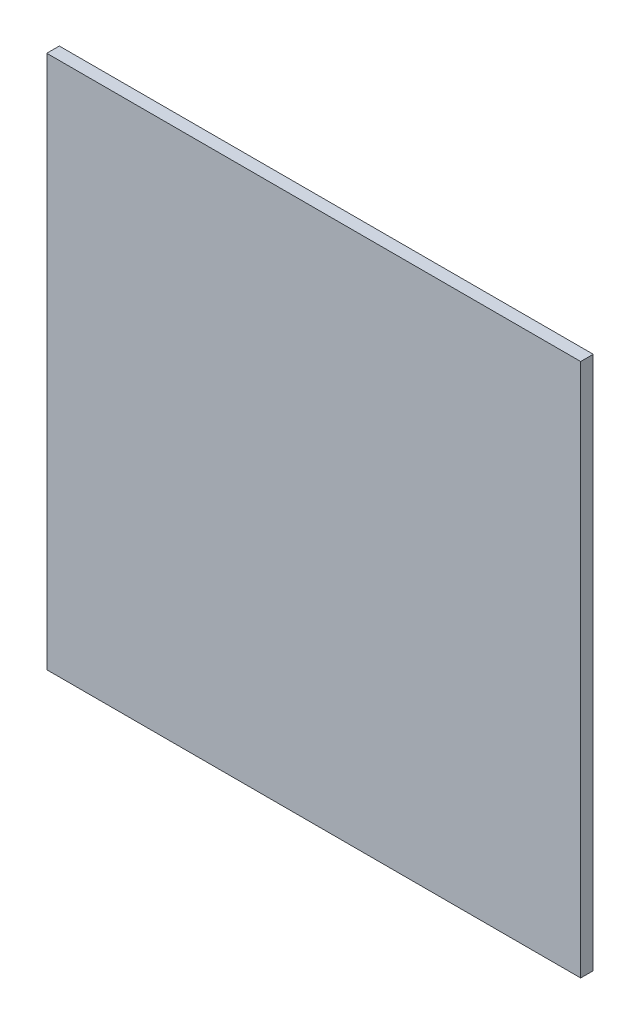
ISO-10303-21;
HEADER;
FILE_DESCRIPTION(('STEP AP214'),'2;1');
FILE_NAME('part.step','',(''),(''),'','','');
FILE_SCHEMA(('AUTOMOTIVE_DESIGN { 1 0 10303 214 1 1 1 1 }'));
ENDSEC;
DATA;
#1=APPLICATION_CONTEXT('core data for automotive mechanical design processes');
#2=APPLICATION_PROTOCOL_DEFINITION('international standard','automotive_design',2000,#1);
#3=PRODUCT_CONTEXT('',#1,'mechanical');
#4=PRODUCT('Part','Part','',(#3));
#5=PRODUCT_RELATED_PRODUCT_CATEGORY('part','',(#4));
#6=PRODUCT_DEFINITION_FORMATION('','',#4);
#7=PRODUCT_DEFINITION_CONTEXT('part definition',#1,'design');
#8=PRODUCT_DEFINITION('design','',#6,#7);
#9=PRODUCT_DEFINITION_SHAPE('','',#8);
#10=(LENGTH_UNIT() NAMED_UNIT(*) SI_UNIT(.MILLI.,.METRE.));
#11=(NAMED_UNIT(*) PLANE_ANGLE_UNIT() SI_UNIT($,.RADIAN.));
#12=(NAMED_UNIT(*) SI_UNIT($,.STERADIAN.) SOLID_ANGLE_UNIT());
#13=UNCERTAINTY_MEASURE_WITH_UNIT(LENGTH_MEASURE(1.E-05),#10,'distance_accuracy_value','');
#14=(GEOMETRIC_REPRESENTATION_CONTEXT(3) GLOBAL_UNCERTAINTY_ASSIGNED_CONTEXT((#13)) GLOBAL_UNIT_ASSIGNED_CONTEXT((#10,
#11,#12)) REPRESENTATION_CONTEXT('',''));
#15=CARTESIAN_POINT('',(0.,0.,0.));
#16=DIRECTION('',(0.,0.,1.));
#17=DIRECTION('',(1.,0.,0.));
#18=AXIS2_PLACEMENT_3D('',#15,#16,#17);
#19=CARTESIAN_POINT('',(2.137,-2.137,0.));
#20=DIRECTION('',(0.,0.,-1.));
#21=DIRECTION('',(-1.,0.,0.));
#22=AXIS2_PLACEMENT_3D('',#19,#20,#21);
#23=PLANE('',#22);
#24=DIRECTION('',(0.,-1.,0.));
#25=VECTOR('',#24,1.);
#26=CARTESIAN_POINT('',(-2.127,0.,0.));
#27=LINE('',#26,#25);
#28=CARTESIAN_POINT('',(-2.127,2.127,0.));
#29=VERTEX_POINT('',#28);
#30=CARTESIAN_POINT('',(-2.127,-2.127,0.));
#31=VERTEX_POINT('',#30);
#32=EDGE_CURVE('E68',#29,#31,#27,.T.);
#33=ORIENTED_EDGE('',*,*,#32,.F.);
#34=DIRECTION('',(-1.,0.,0.));
#35=VECTOR('',#34,1.);
#36=CARTESIAN_POINT('',(0.,2.127,0.));
#37=LINE('',#36,#35);
#38=CARTESIAN_POINT('',(2.127,2.127,0.));
#39=VERTEX_POINT('',#38);
#40=EDGE_CURVE('E55',#39,#29,#37,.T.);
#41=ORIENTED_EDGE('',*,*,#40,.F.);
#42=DIRECTION('',(0.,1.,0.));
#43=VECTOR('',#42,1.);
#44=CARTESIAN_POINT('',(2.127,0.,0.));
#45=LINE('',#44,#43);
#46=CARTESIAN_POINT('',(2.127,-2.127,0.));
#47=VERTEX_POINT('',#46);
#48=EDGE_CURVE('E20',#47,#39,#45,.T.);
#49=ORIENTED_EDGE('',*,*,#48,.F.);
#50=DIRECTION('',(1.,0.,0.));
#51=VECTOR('',#50,1.);
#52=CARTESIAN_POINT('',(0.,-2.127,0.));
#53=LINE('',#52,#51);
#54=EDGE_CURVE('E80',#31,#47,#53,.T.);
#55=ORIENTED_EDGE('',*,*,#54,.F.);
#56=EDGE_LOOP('',(#33,#41,#49,#55));
#57=FACE_BOUND('',#56,.T.);
#58=ADVANCED_FACE('F16',(#57),#23,.T.);
#59=CARTESIAN_POINT('',(2.127,-2.137,0.11));
#60=DIRECTION('',(1.,0.,0.));
#61=DIRECTION('',(0.,0.,-1.));
#62=AXIS2_PLACEMENT_3D('',#59,#60,#61);
#63=PLANE('',#62);
#64=DIRECTION('',(0.,0.,-1.));
#65=VECTOR('',#64,1.);
#66=CARTESIAN_POINT('',(2.127,2.127,0.05));
#67=LINE('',#66,#65);
#68=CARTESIAN_POINT('',(2.127,2.127,0.1));
#69=VERTEX_POINT('',#68);
#70=EDGE_CURVE('E61',#69,#39,#67,.T.);
#71=ORIENTED_EDGE('',*,*,#70,.F.);
#72=DIRECTION('',(0.,1.,0.));
#73=VECTOR('',#72,1.);
#74=CARTESIAN_POINT('',(2.127,0.,0.1));
#75=LINE('',#74,#73);
#76=CARTESIAN_POINT('',(2.127,-2.127,0.1));
#77=VERTEX_POINT('',#76);
#78=EDGE_CURVE('E83',#77,#69,#75,.T.);
#79=ORIENTED_EDGE('',*,*,#78,.F.);
#80=DIRECTION('',(0.,0.,1.));
#81=VECTOR('',#80,1.);
#82=CARTESIAN_POINT('',(2.127,-2.127,0.05));
#83=LINE('',#82,#81);
#84=EDGE_CURVE('E64',#47,#77,#83,.T.);
#85=ORIENTED_EDGE('',*,*,#84,.F.);
#86=ORIENTED_EDGE('',*,*,#48,.T.);
#87=EDGE_LOOP('',(#71,#79,#85,#86));
#88=FACE_BOUND('',#87,.T.);
#89=ADVANCED_FACE('F60',(#88),#63,.T.);
#90=CARTESIAN_POINT('',(-2.137,2.127,-0.01));
#91=DIRECTION('',(0.,1.,0.));
#92=DIRECTION('',(0.,0.,1.));
#93=AXIS2_PLACEMENT_3D('',#90,#91,#92);
#94=PLANE('',#93);
#95=DIRECTION('',(0.,0.,-1.));
#96=VECTOR('',#95,1.);
#97=CARTESIAN_POINT('',(-2.127,2.127,0.05));
#98=LINE('',#97,#96);
#99=CARTESIAN_POINT('',(-2.127,2.127,0.1));
#100=VERTEX_POINT('',#99);
#101=EDGE_CURVE('E70',#100,#29,#98,.T.);
#102=ORIENTED_EDGE('',*,*,#101,.F.);
#103=DIRECTION('',(-1.,0.,0.));
#104=VECTOR('',#103,1.);
#105=CARTESIAN_POINT('',(0.,2.127,0.1));
#106=LINE('',#105,#104);
#107=EDGE_CURVE('E74',#69,#100,#106,.T.);
#108=ORIENTED_EDGE('',*,*,#107,.F.);
#109=ORIENTED_EDGE('',*,*,#70,.T.);
#110=ORIENTED_EDGE('',*,*,#40,.T.);
#111=EDGE_LOOP('',(#102,#108,#109,#110));
#112=FACE_BOUND('',#111,.T.);
#113=ADVANCED_FACE('F72',(#112),#94,.T.);
#114=CARTESIAN_POINT('',(-2.127,-2.137,-0.01));
#115=DIRECTION('',(-1.,0.,0.));
#116=DIRECTION('',(0.,0.,1.));
#117=AXIS2_PLACEMENT_3D('',#114,#115,#116);
#118=PLANE('',#117);
#119=DIRECTION('',(0.,0.,-1.));
#120=VECTOR('',#119,1.);
#121=CARTESIAN_POINT('',(-2.127,-2.127,0.05));
#122=LINE('',#121,#120);
#123=CARTESIAN_POINT('',(-2.127,-2.127,0.1));
#124=VERTEX_POINT('',#123);
#125=EDGE_CURVE('E35',#124,#31,#122,.T.);
#126=ORIENTED_EDGE('',*,*,#125,.F.);
#127=DIRECTION('',(0.,-1.,0.));
#128=VECTOR('',#127,1.);
#129=CARTESIAN_POINT('',(-2.127,0.,0.1));
#130=LINE('',#129,#128);
#131=EDGE_CURVE('E26',#100,#124,#130,.T.);
#132=ORIENTED_EDGE('',*,*,#131,.F.);
#133=ORIENTED_EDGE('',*,*,#101,.T.);
#134=ORIENTED_EDGE('',*,*,#32,.T.);
#135=EDGE_LOOP('',(#126,#132,#133,#134));
#136=FACE_BOUND('',#135,.T.);
#137=ADVANCED_FACE('F88',(#136),#118,.T.);
#138=CARTESIAN_POINT('',(-2.137,-2.127,0.11));
#139=DIRECTION('',(0.,-1.,0.));
#140=DIRECTION('',(0.,0.,-1.));
#141=AXIS2_PLACEMENT_3D('',#138,#139,#140);
#142=PLANE('',#141);
#143=ORIENTED_EDGE('',*,*,#84,.T.);
#144=DIRECTION('',(1.,0.,0.));
#145=VECTOR('',#144,1.);
#146=CARTESIAN_POINT('',(0.,-2.127,0.1));
#147=LINE('',#146,#145);
#148=EDGE_CURVE('E11',#124,#77,#147,.T.);
#149=ORIENTED_EDGE('',*,*,#148,.F.);
#150=ORIENTED_EDGE('',*,*,#125,.T.);
#151=ORIENTED_EDGE('',*,*,#54,.T.);
#152=EDGE_LOOP('',(#143,#149,#150,#151));
#153=FACE_BOUND('',#152,.T.);
#154=ADVANCED_FACE('F90',(#153),#142,.T.);
#155=CARTESIAN_POINT('',(-2.137,-2.137,0.1));
#156=DIRECTION('',(0.,0.,1.));
#157=DIRECTION('',(1.,0.,0.));
#158=AXIS2_PLACEMENT_3D('',#155,#156,#157);
#159=PLANE('',#158);
#160=ORIENTED_EDGE('',*,*,#131,.T.);
#161=ORIENTED_EDGE('',*,*,#148,.T.);
#162=ORIENTED_EDGE('',*,*,#78,.T.);
#163=ORIENTED_EDGE('',*,*,#107,.T.);
#164=EDGE_LOOP('',(#160,#161,#162,#163));
#165=FACE_BOUND('',#164,.T.);
#166=ADVANCED_FACE('F18',(#165),#159,.T.);
#167=CLOSED_SHELL('',(#58,#89,#113,#137,#154,#166));
#168=MANIFOLD_SOLID_BREP('B1',#167);
#169=ADVANCED_BREP_SHAPE_REPRESENTATION('',(#18,#168),#14);
#170=SHAPE_DEFINITION_REPRESENTATION(#9,#169);
ENDSEC;
END-ISO-10303-21;
